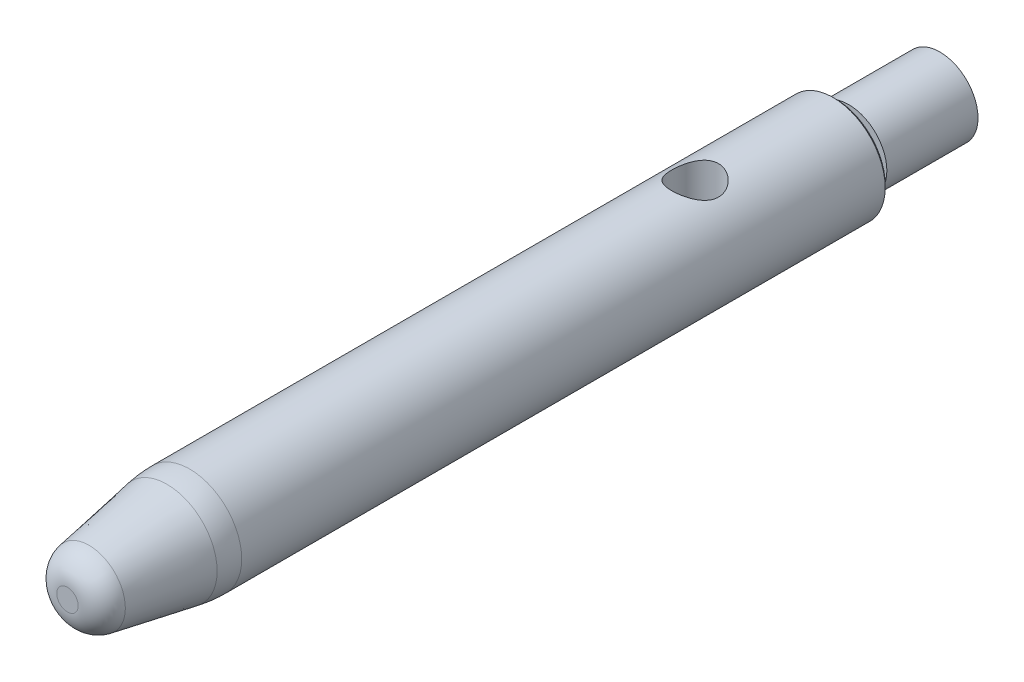
ISO-10303-21;
HEADER;
FILE_DESCRIPTION(('STEP AP214'),'2;1');
FILE_NAME('part.step','',(''),(''),'','','');
FILE_SCHEMA(('AUTOMOTIVE_DESIGN { 1 0 10303 214 1 1 1 1 }'));
ENDSEC;
DATA;
#1=APPLICATION_CONTEXT('core data for automotive mechanical design processes');
#2=APPLICATION_PROTOCOL_DEFINITION('international standard','automotive_design',2000,#1);
#3=PRODUCT_CONTEXT('',#1,'mechanical');
#4=PRODUCT('Part','Part','',(#3));
#5=PRODUCT_RELATED_PRODUCT_CATEGORY('part','',(#4));
#6=PRODUCT_DEFINITION_FORMATION('','',#4);
#7=PRODUCT_DEFINITION_CONTEXT('part definition',#1,'design');
#8=PRODUCT_DEFINITION('design','',#6,#7);
#9=PRODUCT_DEFINITION_SHAPE('','',#8);
#10=(LENGTH_UNIT() NAMED_UNIT(*) SI_UNIT(.MILLI.,.METRE.));
#11=(NAMED_UNIT(*) PLANE_ANGLE_UNIT() SI_UNIT($,.RADIAN.));
#12=(NAMED_UNIT(*) SI_UNIT($,.STERADIAN.) SOLID_ANGLE_UNIT());
#13=UNCERTAINTY_MEASURE_WITH_UNIT(LENGTH_MEASURE(1.E-05),#10,'distance_accuracy_value','');
#14=(GEOMETRIC_REPRESENTATION_CONTEXT(3) GLOBAL_UNCERTAINTY_ASSIGNED_CONTEXT((#13)) GLOBAL_UNIT_ASSIGNED_CONTEXT((#10,
#11,#12)) REPRESENTATION_CONTEXT('',''));
#15=CARTESIAN_POINT('',(0.,0.,0.));
#16=DIRECTION('',(0.,0.,1.));
#17=DIRECTION('',(1.,0.,0.));
#18=AXIS2_PLACEMENT_3D('',#15,#16,#17);
#19=CARTESIAN_POINT('',(0.,0.,0.));
#20=DIRECTION('',(0.,0.,1.));
#21=DIRECTION('',(1.,0.,0.));
#22=AXIS2_PLACEMENT_3D('',#19,#20,#21);
#23=PLANE('',#22);
#24=CARTESIAN_POINT('',(0.,0.,0.));
#25=DIRECTION('',(0.,0.,1.));
#26=DIRECTION('',(1.,0.,0.));
#27=AXIS2_PLACEMENT_3D('',#24,#25,#26);
#28=CIRCLE('',#27,1.4635);
#29=CARTESIAN_POINT('',(1.4635,0.,0.));
#30=VERTEX_POINT('',#29);
#31=EDGE_CURVE('E16',#30,#30,#28,.T.);
#32=ORIENTED_EDGE('',*,*,#31,.F.);
#33=EDGE_LOOP('',(#32));
#34=FACE_BOUND('',#33,.T.);
#35=ADVANCED_FACE('F12',(#34),#23,.F.);
#36=CARTESIAN_POINT('',(0.,0.,0.));
#37=DIRECTION('',(0.,0.,1.));
#38=DIRECTION('',(1.,0.,0.));
#39=AXIS2_PLACEMENT_3D('',#36,#37,#38);
#40=CYLINDRICAL_SURFACE('',#39,1.4635);
#41=CARTESIAN_POINT('',(0.,0.,3.5));
#42=DIRECTION('',(0.,0.,1.));
#43=DIRECTION('',(1.,0.,0.));
#44=AXIS2_PLACEMENT_3D('',#41,#42,#43);
#45=CIRCLE('',#44,1.4635);
#46=CARTESIAN_POINT('',(1.4635,0.,3.5));
#47=VERTEX_POINT('',#46);
#48=EDGE_CURVE('E80',#47,#47,#45,.F.);
#49=ORIENTED_EDGE('',*,*,#48,.T.);
#50=EDGE_LOOP('',(#49));
#51=FACE_BOUND('',#50,.T.);
#52=ORIENTED_EDGE('',*,*,#31,.T.);
#53=EDGE_LOOP('',(#52));
#54=FACE_BOUND('',#53,.T.);
#55=ADVANCED_FACE('F87',(#51,#54),#40,.T.);
#56=CARTESIAN_POINT('',(0.,0.,33.5));
#57=DIRECTION('',(0.,0.,1.));
#58=DIRECTION('',(1.,0.,0.));
#59=AXIS2_PLACEMENT_3D('',#56,#57,#58);
#60=PLANE('',#59);
#61=CARTESIAN_POINT('',(0.,0.,33.5));
#62=DIRECTION('',(0.,0.,-1.));
#63=DIRECTION('',(-1.,0.,0.));
#64=AXIS2_PLACEMENT_3D('',#61,#62,#63);
#65=CIRCLE('',#64,0.410900368822721);
#66=CARTESIAN_POINT('',(-0.410900368822721,0.,33.5));
#67=VERTEX_POINT('',#66);
#68=EDGE_CURVE('E78',#67,#67,#65,.F.);
#69=ORIENTED_EDGE('',*,*,#68,.T.);
#70=EDGE_LOOP('',(#69));
#71=FACE_BOUND('',#70,.T.);
#72=ADVANCED_FACE('F94',(#71),#60,.T.);
#73=CARTESIAN_POINT('',(2.2738441186207,0.,3.5));
#74=DIRECTION('',(0.,0.,-1.));
#75=DIRECTION('',(-1.,0.,0.));
#76=AXIS2_PLACEMENT_3D('',#73,#74,#75);
#77=PLANE('',#76);
#78=CARTESIAN_POINT('',(0.,0.,3.5));
#79=DIRECTION('',(0.,0.,1.));
#80=DIRECTION('',(1.,0.,0.));
#81=AXIS2_PLACEMENT_3D('',#78,#79,#80);
#82=CIRCLE('',#81,1.175);
#83=CARTESIAN_POINT('',(1.175,0.,3.5));
#84=VERTEX_POINT('',#83);
#85=EDGE_CURVE('E74',#84,#84,#82,.T.);
#86=ORIENTED_EDGE('',*,*,#85,.F.);
#87=EDGE_LOOP('',(#86));
#88=FACE_BOUND('',#87,.T.);
#89=ORIENTED_EDGE('',*,*,#48,.F.);
#90=EDGE_LOOP('',(#89));
#91=FACE_BOUND('',#90,.T.);
#92=ADVANCED_FACE('F100',(#88,#91),#77,.F.);
#93=CARTESIAN_POINT('',(0.,0.,32.5));
#94=DIRECTION('',(0.,0.,-1.));
#95=DIRECTION('',(-1.,0.,0.));
#96=AXIS2_PLACEMENT_3D('',#93,#94,#95);
#97=DEGENERATE_TOROIDAL_SURFACE('',#96,0.410900368822721,1.00000000000002,.T.);
#98=ORIENTED_EDGE('',*,*,#68,.F.);
#99=EDGE_LOOP('',(#98));
#100=FACE_BOUND('',#99,.T.);
#101=CARTESIAN_POINT('',(0.,0.,32.6736481776493));
#102=DIRECTION('',(0.,0.,-1.));
#103=DIRECTION('',(1.,0.,0.));
#104=AXIS2_PLACEMENT_3D('',#101,#102,#103);
#105=CIRCLE('',#104,1.39570812186207);
#106=CARTESIAN_POINT('',(1.39570812186207,0.,32.6736481776493));
#107=VERTEX_POINT('',#106);
#108=EDGE_CURVE('E32',#107,#107,#105,.T.);
#109=ORIENTED_EDGE('',*,*,#108,.F.);
#110=EDGE_LOOP('',(#109));
#111=FACE_BOUND('',#110,.T.);
#112=ADVANCED_FACE('F97',(#100,#111),#97,.T.);
#113=CARTESIAN_POINT('',(0.,0.,3.75));
#114=DIRECTION('',(0.,0.,1.));
#115=DIRECTION('',(1.,0.,0.));
#116=AXIS2_PLACEMENT_3D('',#113,#114,#115);
#117=CYLINDRICAL_SURFACE('',#116,1.175);
#118=CARTESIAN_POINT('',(0.,0.,4.));
#119=DIRECTION('',(0.,0.,1.));
#120=DIRECTION('',(1.,0.,0.));
#121=AXIS2_PLACEMENT_3D('',#118,#119,#120);
#122=CIRCLE('',#121,1.175);
#123=CARTESIAN_POINT('',(1.175,0.,4.));
#124=VERTEX_POINT('',#123);
#125=EDGE_CURVE('E66',#124,#124,#122,.F.);
#126=ORIENTED_EDGE('',*,*,#125,.T.);
#127=EDGE_LOOP('',(#126));
#128=FACE_BOUND('',#127,.T.);
#129=ORIENTED_EDGE('',*,*,#85,.T.);
#130=EDGE_LOOP('',(#129));
#131=FACE_BOUND('',#130,.T.);
#132=ADVANCED_FACE('F99',(#128,#131),#117,.T.);
#133=CARTESIAN_POINT('',(0.,0.,29.6773362061344));
#134=DIRECTION('',(0.,0.,-1.));
#135=DIRECTION('',(-1.,0.,0.));
#136=AXIS2_PLACEMENT_3D('',#133,#134,#135);
#137=CONICAL_SURFACE('',#136,1.92403876505409,0.174532925197016);
#138=CARTESIAN_POINT('',(0.,0.,29.6773362059918));
#139=DIRECTION('',(0.,0.,1.));
#140=DIRECTION('',(1.,0.,0.));
#141=AXIS2_PLACEMENT_3D('',#138,#139,#140);
#142=CIRCLE('',#141,1.92403876506104);
#143=CARTESIAN_POINT('',(1.92403876506104,0.,29.6773362059918));
#144=VERTEX_POINT('',#143);
#145=EDGE_CURVE('E64',#144,#144,#142,.T.);
#146=ORIENTED_EDGE('',*,*,#145,.T.);
#147=EDGE_LOOP('',(#146));
#148=FACE_BOUND('',#147,.T.);
#149=ORIENTED_EDGE('',*,*,#108,.T.);
#150=EDGE_LOOP('',(#149));
#151=FACE_BOUND('',#150,.T.);
#152=ADVANCED_FACE('F106',(#148,#151),#137,.T.);
#153=CARTESIAN_POINT('',(0.,0.,4.));
#154=DIRECTION('',(0.,0.,1.));
#155=DIRECTION('',(1.,0.,0.));
#156=AXIS2_PLACEMENT_3D('',#153,#154,#155);
#157=PLANE('',#156);
#158=ORIENTED_EDGE('',*,*,#125,.F.);
#159=EDGE_LOOP('',(#158));
#160=FACE_BOUND('',#159,.T.);
#161=CARTESIAN_POINT('',(0.,0.,4.0000000000191));
#162=DIRECTION('',(0.,0.,1.));
#163=DIRECTION('',(1.,0.,0.));
#164=AXIS2_PLACEMENT_3D('',#161,#162,#163);
#165=CIRCLE('',#164,1.90000000003465);
#166=CARTESIAN_POINT('',(1.90000000003465,0.,4.0000000000191));
#167=VERTEX_POINT('',#166);
#168=EDGE_CURVE('E60',#167,#167,#165,.T.);
#169=ORIENTED_EDGE('',*,*,#168,.F.);
#170=EDGE_LOOP('',(#169));
#171=FACE_BOUND('',#170,.T.);
#172=ADVANCED_FACE('F115',(#160,#171),#157,.F.);
#173=CARTESIAN_POINT('',(0.,0.,28.8090953176571));
#174=DIRECTION('',(0.,0.,1.));
#175=DIRECTION('',(1.,0.,0.));
#176=AXIS2_PLACEMENT_3D('',#173,#174,#175);
#177=DEGENERATE_TOROIDAL_SURFACE('',#176,3.0000000000011,5.0000000000011,.F.);
#178=CARTESIAN_POINT('',(0.,0.,28.8090953176571));
#179=DIRECTION('',(0.,0.,1.));
#180=DIRECTION('',(1.,0.,0.));
#181=AXIS2_PLACEMENT_3D('',#178,#179,#180);
#182=CIRCLE('',#181,2.);
#183=CARTESIAN_POINT('',(2.,0.,28.8090953176571));
#184=VERTEX_POINT('',#183);
#185=EDGE_CURVE('E58',#184,#184,#182,.F.);
#186=ORIENTED_EDGE('',*,*,#185,.F.);
#187=EDGE_LOOP('',(#186));
#188=FACE_BOUND('',#187,.T.);
#189=ORIENTED_EDGE('',*,*,#145,.F.);
#190=EDGE_LOOP('',(#189));
#191=FACE_BOUND('',#190,.T.);
#192=ADVANCED_FACE('F14',(#188,#191),#177,.F.);
#193=CARTESIAN_POINT('',(0.,0.,4.09999999993715));
#194=DIRECTION('',(0.,0.,1.));
#195=DIRECTION('',(1.,0.,0.));
#196=AXIS2_PLACEMENT_3D('',#193,#194,#195);
#197=CONICAL_SURFACE('',#196,1.99999999995271,0.785398163397448);
#198=ORIENTED_EDGE('',*,*,#168,.T.);
#199=EDGE_LOOP('',(#198));
#200=FACE_BOUND('',#199,.T.);
#201=CARTESIAN_POINT('',(0.,0.,4.1));
#202=DIRECTION('',(0.,0.,1.));
#203=DIRECTION('',(1.,0.,0.));
#204=AXIS2_PLACEMENT_3D('',#201,#202,#203);
#205=CIRCLE('',#204,2.);
#206=CARTESIAN_POINT('',(2.,0.,4.1));
#207=VERTEX_POINT('',#206);
#208=EDGE_CURVE('E25',#207,#207,#205,.T.);
#209=ORIENTED_EDGE('',*,*,#208,.F.);
#210=EDGE_LOOP('',(#209));
#211=FACE_BOUND('',#210,.T.);
#212=ADVANCED_FACE('F49',(#200,#211),#197,.T.);
#213=CARTESIAN_POINT('',(0.,0.,9.4));
#214=DIRECTION('',(0.,1.,0.));
#215=DIRECTION('',(0.,0.,1.));
#216=AXIS2_PLACEMENT_3D('',#213,#214,#215);
#217=CYLINDRICAL_SURFACE('',#216,0.9);
#218=CARTESIAN_POINT('',(-0.9,1.78605710994918,9.4));
#219=CARTESIAN_POINT('',(-0.89999390487253,1.78606338167853,9.35240548689368));
#220=CARTESIAN_POINT('',(-0.896200889187128,1.78798753333791,9.30475139816036));
#221=CARTESIAN_POINT('',(-0.881188698473984,1.79543069887251,9.21084342785602));
#222=CARTESIAN_POINT('',(-0.869950988465884,1.80095868462874,9.16459334315639));
#223=CARTESIAN_POINT('',(-0.840599008940143,1.81484257249622,9.07503289355946));
#224=CARTESIAN_POINT('',(-0.822515951116448,1.82318562070555,9.0317102221631));
#225=CARTESIAN_POINT('',(-0.780079367805811,1.84174115190354,8.94872389073461));
#226=CARTESIAN_POINT('',(-0.755726606794494,1.85195340693276,8.90905978540756));
#227=CARTESIAN_POINT('',(-0.699546711070863,1.87392676776757,8.83160603570529));
#228=CARTESIAN_POINT('',(-0.667331674041415,1.88574564470359,8.79411401006394));
#229=CARTESIAN_POINT('',(-0.597153263851514,1.90912956292408,8.72484038468546));
#230=CARTESIAN_POINT('',(-0.559187461249459,1.92069449455256,8.69306121084002));
#231=CARTESIAN_POINT('',(-0.476161359501933,1.94298992227222,8.63450567582868));
#232=CARTESIAN_POINT('',(-0.430834539343588,1.95364558316684,8.60807609709969));
#233=CARTESIAN_POINT('',(-0.335810404296621,1.97219898029653,8.56334920878371));
#234=CARTESIAN_POINT('',(-0.286115352664621,1.98009813430407,8.54504771729886));
#235=CARTESIAN_POINT('',(-0.186901452751729,1.99183646737535,8.51821250843488));
#236=CARTESIAN_POINT('',(-0.137548112421341,1.99588928212587,8.50916232212248));
#237=CARTESIAN_POINT('',(-0.0378686070773556,2.0002624891057,8.49940557553892));
#238=CARTESIAN_POINT('',(0.0124570810842968,2.00058466657332,8.49869502446314));
#239=CARTESIAN_POINT('',(0.108849972245188,1.99757696729492,8.50539384596546));
#240=CARTESIAN_POINT('',(0.15496649299864,1.99450393840056,8.51223211788822));
#241=CARTESIAN_POINT('',(0.245315383693987,1.98541747030715,8.53283927407892));
#242=CARTESIAN_POINT('',(0.289547613734815,1.97940381319038,8.54660867198596));
#243=CARTESIAN_POINT('',(0.375691598160862,1.96489045613952,8.58083122022899));
#244=CARTESIAN_POINT('',(0.417557901504177,1.95635438264072,8.60138271461349));
#245=CARTESIAN_POINT('',(0.497357287702657,1.93760635143006,8.64847851805163));
#246=CARTESIAN_POINT('',(0.535288925003646,1.92739378132494,8.67502501830642));
#247=CARTESIAN_POINT('',(0.609380701173242,1.90532592563194,8.73582233428805));
#248=CARTESIAN_POINT('',(0.645154693729103,1.89340458186776,8.77052032933998));
#249=CARTESIAN_POINT('',(0.710559970434975,1.86984371630062,8.8454029202132));
#250=CARTESIAN_POINT('',(0.740188046622066,1.85820434446292,8.88559036328407));
#251=CARTESIAN_POINT('',(0.793695924071003,1.83600756729651,8.97249427021132));
#252=CARTESIAN_POINT('',(0.817268860971867,1.8255194409972,9.01941897480158));
#253=CARTESIAN_POINT('',(0.856015337124757,1.80767749679039,9.11716561883767));
#254=CARTESIAN_POINT('',(0.871196023095027,1.80032101325333,9.16798420018762));
#255=CARTESIAN_POINT('',(0.891656994529557,1.79027082406952,9.26819749552869));
#256=CARTESIAN_POINT('',(0.897569748987037,1.78728031131523,9.31743255225251));
#257=CARTESIAN_POINT('',(0.901208969880135,1.78544905415977,9.41627172402793));
#258=CARTESIAN_POINT('',(0.898939157691918,1.78660642332847,9.46587566107441));
#259=CARTESIAN_POINT('',(0.886856864654278,1.79263003607399,9.55984006595055));
#260=CARTESIAN_POINT('',(0.877662975422487,1.79719184172154,9.60430232391156));
#261=CARTESIAN_POINT('',(0.852850169677463,1.80909769961321,9.69099986183819));
#262=CARTESIAN_POINT('',(0.837229572866819,1.81644247944124,9.73323455613474));
#263=CARTESIAN_POINT('',(0.799237138333728,1.83348592527057,9.81641926831179));
#264=CARTESIAN_POINT('',(0.776592491950458,1.84327584388849,9.8572253459788));
#265=CARTESIAN_POINT('',(0.725451711556348,1.86399582272393,9.93467344552787));
#266=CARTESIAN_POINT('',(0.696952786665905,1.87492642550656,9.97131346835808));
#267=CARTESIAN_POINT('',(0.631635509686239,1.89798533781934,10.0431302151763));
#268=CARTESIAN_POINT('',(0.594275910014916,1.91012616661146,10.0778127580702));
#269=CARTESIAN_POINT('',(0.514011989746334,1.9332704992432,10.140530617557));
#270=CARTESIAN_POINT('',(0.471106798890534,1.94427382408779,10.1685648888882));
#271=CARTESIAN_POINT('',(0.380272883636554,1.96407017158726,10.2173584566265));
#272=CARTESIAN_POINT('',(0.332298381010361,1.97284008802807,10.2380425130555));
#273=CARTESIAN_POINT('',(0.233047815748497,1.98700633430142,10.2708704994459));
#274=CARTESIAN_POINT('',(0.181774108719046,1.99240504230559,10.283020450429));
#275=CARTESIAN_POINT('',(0.0817579255423353,1.99890645397916,10.2975884169908));
#276=CARTESIAN_POINT('',(0.0331358435645508,2.0003150723876,10.3006999352773));
#277=CARTESIAN_POINT('',(-0.0639393119822124,1.9995663192658,10.2990364751529));
#278=CARTESIAN_POINT('',(-0.112392422117786,1.99740977432866,10.2942633248247));
#279=CARTESIAN_POINT('',(-0.205419795030557,1.9899452279521,10.2774590572931));
#280=CARTESIAN_POINT('',(-0.250069779822175,1.98478776285301,10.2657742182714));
#281=CARTESIAN_POINT('',(-0.336738101718439,1.97193518813126,10.2358886480381));
#282=CARTESIAN_POINT('',(-0.37875598402859,1.964239641391,10.2176867943965));
#283=CARTESIAN_POINT('',(-0.46110067762479,1.94659715338735,10.1743701094681));
#284=CARTESIAN_POINT('',(-0.501261896017322,1.93656323977839,10.1489768414746));
#285=CARTESIAN_POINT('',(-0.576929844379537,1.91538465361302,10.0923775815154));
#286=CARTESIAN_POINT('',(-0.612434556376682,1.90423950314277,10.0611690835148));
#287=CARTESIAN_POINT('',(-0.680786789817281,1.88094034143955,9.99086647347915));
#288=CARTESIAN_POINT('',(-0.713186761450653,1.86877767626614,9.9513385975932));
#289=CARTESIAN_POINT('',(-0.770997488724104,1.84568017521229,9.86709014871487));
#290=CARTESIAN_POINT('',(-0.79640375121717,1.83474613132311,9.82236626362991));
#291=CARTESIAN_POINT('',(-0.839517050419587,1.81542690284033,9.72847541836615));
#292=CARTESIAN_POINT('',(-0.857176570884017,1.80705754106676,9.67928321166691));
#293=CARTESIAN_POINT('',(-0.883716361106232,1.79423274699449,9.57820111079373));
#294=CARTESIAN_POINT('',(-0.892626096216152,1.7897641842428,9.52632089442746));
#295=CARTESIAN_POINT('',(-0.898984642632156,1.7865680275393,9.44942674160882));
#296=CARTESIAN_POINT('',(-0.900003165913871,1.78605385230525,9.42472140738367));
#297=CARTESIAN_POINT('',(-0.9,1.78605710994918,9.4));
#298=B_SPLINE_CURVE_WITH_KNOTS('',3,(#218,#219,#220,#221,#222,#223,#224,#225,#226,#227,#228,
#229,#230,#231,#232,#233,#234,#235,#236,#237,#238,#239,#240,#241,#242,#243,#244,#245,#246,#247,
#248,#249,#250,#251,#252,#253,#254,#255,#256,#257,#258,#259,#260,#261,#262,#263,#264,#265,#266,
#267,#268,#269,#270,#271,#272,#273,#274,#275,#276,#277,#278,#279,#280,#281,#282,#283,#284,#285,
#286,#287,#288,#289,#290,#291,#292,#293,#294,#295,#296,#297),.UNSPECIFIED.,.T.,.F.,(4,2,2,2,2,2,
2,2,2,2,2,2,2,2,2,2,2,2,2,2,2,2,2,2,2,2,2,2,2,2,2,2,2,2,2,2,2,2,2,4),(0.,0.142703897195022,
0.285764424829257,0.428180367939294,0.570578954247399,0.72239840777839,0.874282178053421,
1.03407679431295,1.19378910078847,1.34399687882985,1.49413277430874,1.63364332074005,
1.77316420728406,1.91480430355703,2.05649625394221,2.20955360005846,2.36269063707454,
2.52250293779006,2.68217893421481,2.83039266934072,2.97853900636435,3.11482143159979,
3.25113951127788,3.39360809190202,3.53614474910745,3.69263163774131,3.84914311343323,
4.00721344708392,4.16517214589279,4.31064184199307,4.45607781526713,4.5947800621642,
4.73350620934802,4.8785861004638,5.02372865800168,5.18061690173491,5.33760570518743,
5.49554440847012,5.65294940233065,5.72707225699489),.UNSPECIFIED.);
#299=CARTESIAN_POINT('',(-0.9,1.78605710994918,9.4));
#300=VERTEX_POINT('',#299);
#301=EDGE_CURVE('E20',#300,#300,#298,.T.);
#302=ORIENTED_EDGE('',*,*,#301,.F.);
#303=EDGE_LOOP('',(#302));
#304=FACE_BOUND('',#303,.T.);
#305=CARTESIAN_POINT('',(-0.9,-1.78605710994918,9.4));
#306=CARTESIAN_POINT('',(-0.89999390487253,-1.78606338167853,9.44759451310632));
#307=CARTESIAN_POINT('',(-0.896200889187128,-1.78798753333791,9.49524860183964));
#308=CARTESIAN_POINT('',(-0.881188698473984,-1.79543069887251,9.58915657214398));
#309=CARTESIAN_POINT('',(-0.869950988465884,-1.80095868462874,9.63540665684361));
#310=CARTESIAN_POINT('',(-0.840599008940143,-1.81484257249622,9.72496710644054));
#311=CARTESIAN_POINT('',(-0.822515951116448,-1.82318562070555,9.7682897778369));
#312=CARTESIAN_POINT('',(-0.780079367805811,-1.84174115190354,9.8512761092654));
#313=CARTESIAN_POINT('',(-0.755726606794494,-1.85195340693276,9.89094021459244));
#314=CARTESIAN_POINT('',(-0.699546711070863,-1.87392676776757,9.96839396429472));
#315=CARTESIAN_POINT('',(-0.667331674041414,-1.88574564470359,10.0058859899361));
#316=CARTESIAN_POINT('',(-0.597153263851513,-1.90912956292408,10.0751596153145));
#317=CARTESIAN_POINT('',(-0.559187461249458,-1.92069449455256,10.10693878916));
#318=CARTESIAN_POINT('',(-0.476161359501932,-1.94298992227222,10.1654943241713));
#319=CARTESIAN_POINT('',(-0.430834539343587,-1.95364558316684,10.1919239029003));
#320=CARTESIAN_POINT('',(-0.33581040429662,-1.97219898029653,10.2366507912163));
#321=CARTESIAN_POINT('',(-0.286115352664621,-1.98009813430407,10.2549522827011));
#322=CARTESIAN_POINT('',(-0.186901452751729,-1.99183646737535,10.2817874915651));
#323=CARTESIAN_POINT('',(-0.137548112421341,-1.99588928212587,10.2908376778775));
#324=CARTESIAN_POINT('',(-0.0378686070773556,-2.0002624891057,10.3005944244611));
#325=CARTESIAN_POINT('',(0.0124570810842968,-2.00058466657332,10.3013049755369));
#326=CARTESIAN_POINT('',(0.108849972245188,-1.99757696729492,10.2946061540345));
#327=CARTESIAN_POINT('',(0.15496649299864,-1.99450393840056,10.2877678821118));
#328=CARTESIAN_POINT('',(0.245315383693987,-1.98541747030715,10.2671607259211));
#329=CARTESIAN_POINT('',(0.289547613734815,-1.97940381319038,10.253391328014));
#330=CARTESIAN_POINT('',(0.375691598160862,-1.96489045613952,10.219168779771));
#331=CARTESIAN_POINT('',(0.417557901504177,-1.95635438264072,10.1986172853865));
#332=CARTESIAN_POINT('',(0.497357287702657,-1.93760635143006,10.1515214819484));
#333=CARTESIAN_POINT('',(0.535288925003646,-1.92739378132494,10.1249749816936));
#334=CARTESIAN_POINT('',(0.609380701173242,-1.90532592563194,10.064177665712));
#335=CARTESIAN_POINT('',(0.645154693729102,-1.89340458186776,10.02947967066));
#336=CARTESIAN_POINT('',(0.710559970434974,-1.86984371630062,9.9545970797868));
#337=CARTESIAN_POINT('',(0.740188046622066,-1.85820434446292,9.91440963671593));
#338=CARTESIAN_POINT('',(0.793695924071003,-1.83600756729651,9.82750572978868));
#339=CARTESIAN_POINT('',(0.817268860971867,-1.8255194409972,9.78058102519842));
#340=CARTESIAN_POINT('',(0.856015337124757,-1.80767749679039,9.68283438116233));
#341=CARTESIAN_POINT('',(0.871196023095027,-1.80032101325333,9.63201579981238));
#342=CARTESIAN_POINT('',(0.891656994529558,-1.79027082406952,9.53180250447131));
#343=CARTESIAN_POINT('',(0.897569748987037,-1.78728031131523,9.48256744774748));
#344=CARTESIAN_POINT('',(0.901208969880134,-1.78544905415977,9.38372827597207));
#345=CARTESIAN_POINT('',(0.898939157691918,-1.78660642332847,9.33412433892559));
#346=CARTESIAN_POINT('',(0.886856864654278,-1.79263003607399,9.24015993404945));
#347=CARTESIAN_POINT('',(0.877662975422487,-1.79719184172154,9.19569767608844));
#348=CARTESIAN_POINT('',(0.852850169677463,-1.80909769961321,9.10900013816181));
#349=CARTESIAN_POINT('',(0.837229572866819,-1.81644247944124,9.06676544386526));
#350=CARTESIAN_POINT('',(0.799237138333728,-1.83348592527057,8.98358073168822));
#351=CARTESIAN_POINT('',(0.776592491950458,-1.84327584388849,8.9427746540212));
#352=CARTESIAN_POINT('',(0.725451711556348,-1.86399582272393,8.86532655447213));
#353=CARTESIAN_POINT('',(0.696952786665905,-1.87492642550656,8.82868653164192));
#354=CARTESIAN_POINT('',(0.631635509686239,-1.89798533781934,8.75686978482374));
#355=CARTESIAN_POINT('',(0.594275910014916,-1.91012616661146,8.72218724192977));
#356=CARTESIAN_POINT('',(0.514011989746334,-1.9332704992432,8.65946938244304));
#357=CARTESIAN_POINT('',(0.471106798890534,-1.94427382408779,8.63143511111179));
#358=CARTESIAN_POINT('',(0.380272883636553,-1.96407017158726,8.58264154337348));
#359=CARTESIAN_POINT('',(0.332298381010361,-1.97284008802807,8.56195748694447));
#360=CARTESIAN_POINT('',(0.233047815748497,-1.98700633430142,8.52912950055414));
#361=CARTESIAN_POINT('',(0.181774108719046,-1.99240504230559,8.51697954957101));
#362=CARTESIAN_POINT('',(0.0817579255423353,-1.99890645397916,8.50241158300916));
#363=CARTESIAN_POINT('',(0.0331358435645508,-2.0003150723876,8.49930006472273));
#364=CARTESIAN_POINT('',(-0.0639393119822124,-1.9995663192658,8.50096352484713));
#365=CARTESIAN_POINT('',(-0.112392422117786,-1.99740977432866,8.50573667517526));
#366=CARTESIAN_POINT('',(-0.205419795030557,-1.9899452279521,8.52254094270694));
#367=CARTESIAN_POINT('',(-0.250069779822175,-1.98478776285301,8.53422578172864));
#368=CARTESIAN_POINT('',(-0.336738101718439,-1.97193518813126,8.5641113519619));
#369=CARTESIAN_POINT('',(-0.37875598402859,-1.964239641391,8.58231320560349));
#370=CARTESIAN_POINT('',(-0.46110067762479,-1.94659715338735,8.62562989053194));
#371=CARTESIAN_POINT('',(-0.501261896017322,-1.93656323977839,8.65102315852538));
#372=CARTESIAN_POINT('',(-0.576929844379537,-1.91538465361302,8.70762241848462));
#373=CARTESIAN_POINT('',(-0.612434556376682,-1.90423950314277,8.73883091648523));
#374=CARTESIAN_POINT('',(-0.680786789817281,-1.88094034143955,8.80913352652085));
#375=CARTESIAN_POINT('',(-0.713186761450653,-1.86877767626614,8.8486614024068));
#376=CARTESIAN_POINT('',(-0.770997488724104,-1.84568017521229,8.93290985128513));
#377=CARTESIAN_POINT('',(-0.79640375121717,-1.83474613132311,8.97763373637009));
#378=CARTESIAN_POINT('',(-0.839517050419587,-1.81542690284033,9.07152458163385));
#379=CARTESIAN_POINT('',(-0.857176570884017,-1.80705754106676,9.12071678833309));
#380=CARTESIAN_POINT('',(-0.883716361106232,-1.79423274699449,9.22179888920627));
#381=CARTESIAN_POINT('',(-0.892626096216152,-1.7897641842428,9.27367910557254));
#382=CARTESIAN_POINT('',(-0.898984642632156,-1.7865680275393,9.35057325839118));
#383=CARTESIAN_POINT('',(-0.900003165913871,-1.78605385230525,9.37527859261633));
#384=CARTESIAN_POINT('',(-0.9,-1.78605710994918,9.4));
#385=B_SPLINE_CURVE_WITH_KNOTS('',3,(#305,#306,#307,#308,#309,#310,#311,#312,#313,#314,#315,
#316,#317,#318,#319,#320,#321,#322,#323,#324,#325,#326,#327,#328,#329,#330,#331,#332,#333,#334,
#335,#336,#337,#338,#339,#340,#341,#342,#343,#344,#345,#346,#347,#348,#349,#350,#351,#352,#353,
#354,#355,#356,#357,#358,#359,#360,#361,#362,#363,#364,#365,#366,#367,#368,#369,#370,#371,#372,
#373,#374,#375,#376,#377,#378,#379,#380,#381,#382,#383,#384),.UNSPECIFIED.,.T.,.F.,(4,2,2,2,2,2,
2,2,2,2,2,2,2,2,2,2,2,2,2,2,2,2,2,2,2,2,2,2,2,2,2,2,2,2,2,2,2,2,2,4),(0.,0.142703897195022,
0.285764424829257,0.428180367939294,0.570578954247399,0.722398407778393,0.874282178053421,
1.03407679431295,1.19378910078847,1.34399687882985,1.49413277430874,1.63364332074005,
1.77316420728406,1.91480430355703,2.05649625394221,2.20955360005846,2.36269063707454,
2.52250293779006,2.68217893421481,2.83039266934072,2.97853900636435,3.11482143159979,
3.25113951127788,3.39360809190202,3.53614474910745,3.69263163774131,3.84914311343323,
4.00721344708392,4.16517214589279,4.31064184199306,4.45607781526713,4.5947800621642,
4.73350620934802,4.8785861004638,5.02372865800168,5.18061690173491,5.33760570518743,
5.49554440847012,5.65294940233065,5.72707225699489),.UNSPECIFIED.);
#386=CARTESIAN_POINT('',(-0.9,-1.78605710994918,9.4));
#387=VERTEX_POINT('',#386);
#388=EDGE_CURVE('E8',#387,#387,#385,.T.);
#389=ORIENTED_EDGE('',*,*,#388,.F.);
#390=EDGE_LOOP('',(#389));
#391=FACE_BOUND('',#390,.T.);
#392=ADVANCED_FACE('F37',(#304,#391),#217,.F.);
#393=CARTESIAN_POINT('',(0.,0.,0.));
#394=DIRECTION('',(0.,0.,1.));
#395=DIRECTION('',(1.,0.,0.));
#396=AXIS2_PLACEMENT_3D('',#393,#394,#395);
#397=CYLINDRICAL_SURFACE('',#396,2.);
#398=ORIENTED_EDGE('',*,*,#208,.T.);
#399=EDGE_LOOP('',(#398));
#400=FACE_BOUND('',#399,.T.);
#401=ORIENTED_EDGE('',*,*,#388,.T.);
#402=EDGE_LOOP('',(#401));
#403=FACE_BOUND('',#402,.T.);
#404=ORIENTED_EDGE('',*,*,#301,.T.);
#405=EDGE_LOOP('',(#404));
#406=FACE_BOUND('',#405,.T.);
#407=ORIENTED_EDGE('',*,*,#185,.T.);
#408=EDGE_LOOP('',(#407));
#409=FACE_BOUND('',#408,.T.);
#410=ADVANCED_FACE('F40',(#400,#403,#406,#409),#397,.T.);
#411=CLOSED_SHELL('',(#35,#55,#72,#92,#112,#132,#152,#172,#192,#212,#392,#410));
#412=MANIFOLD_SOLID_BREP('B1',#411);
#413=ADVANCED_BREP_SHAPE_REPRESENTATION('',(#18,#412),#14);
#414=SHAPE_DEFINITION_REPRESENTATION(#9,#413);
ENDSEC;
END-ISO-10303-21;
